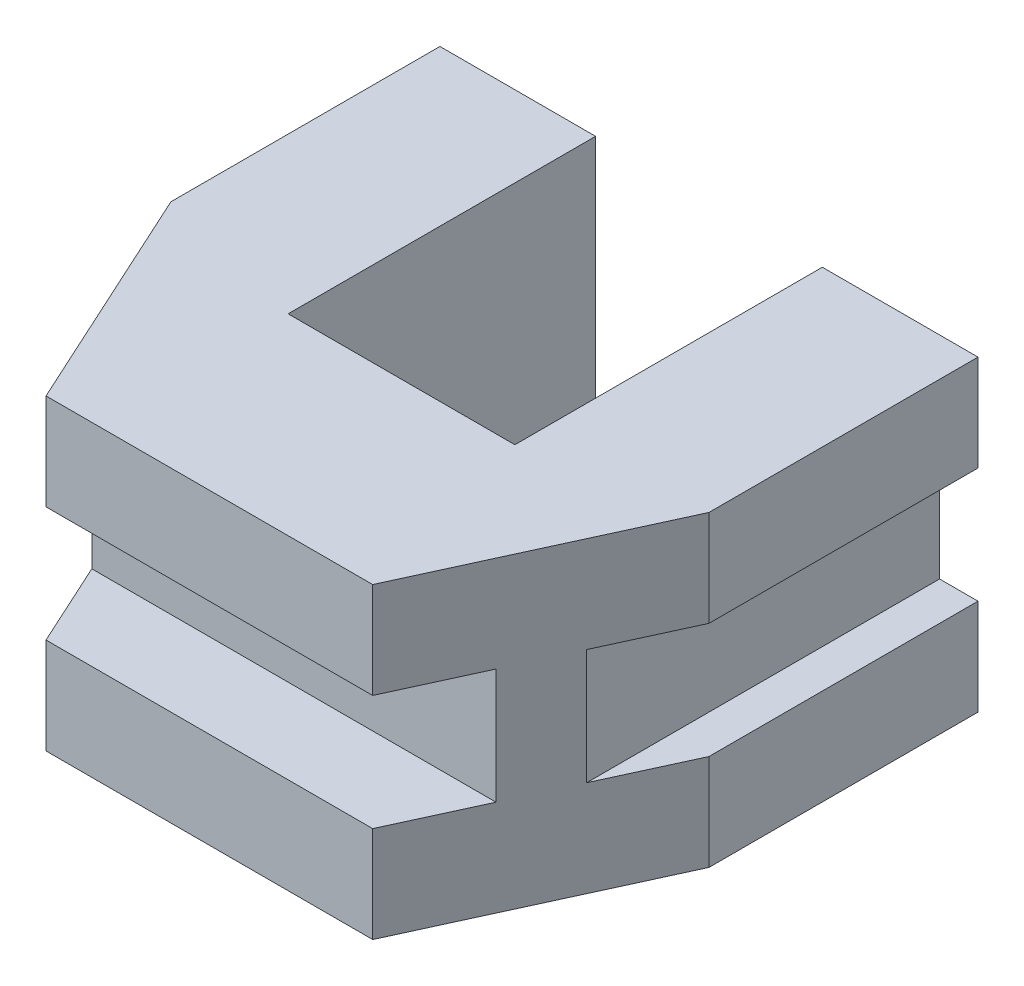
ISO-10303-21;
HEADER;
FILE_DESCRIPTION(('STEP AP214'),'2;1');
FILE_NAME('part.step','',(''),(''),'','','');
FILE_SCHEMA(('AUTOMOTIVE_DESIGN { 1 0 10303 214 1 1 1 1 }'));
ENDSEC;
DATA;
#1=APPLICATION_CONTEXT('core data for automotive mechanical design processes');
#2=APPLICATION_PROTOCOL_DEFINITION('international standard','automotive_design',2000,#1);
#3=PRODUCT_CONTEXT('',#1,'mechanical');
#4=PRODUCT('Part','Part','',(#3));
#5=PRODUCT_RELATED_PRODUCT_CATEGORY('part','',(#4));
#6=PRODUCT_DEFINITION_FORMATION('','',#4);
#7=PRODUCT_DEFINITION_CONTEXT('part definition',#1,'design');
#8=PRODUCT_DEFINITION('design','',#6,#7);
#9=PRODUCT_DEFINITION_SHAPE('','',#8);
#10=(LENGTH_UNIT() NAMED_UNIT(*) SI_UNIT(.MILLI.,.METRE.));
#11=(NAMED_UNIT(*) PLANE_ANGLE_UNIT() SI_UNIT($,.RADIAN.));
#12=(NAMED_UNIT(*) SI_UNIT($,.STERADIAN.) SOLID_ANGLE_UNIT());
#13=UNCERTAINTY_MEASURE_WITH_UNIT(LENGTH_MEASURE(1.E-05),#10,'distance_accuracy_value','');
#14=(GEOMETRIC_REPRESENTATION_CONTEXT(3) GLOBAL_UNCERTAINTY_ASSIGNED_CONTEXT((#13)) GLOBAL_UNIT_ASSIGNED_CONTEXT((#10,
#11,#12)) REPRESENTATION_CONTEXT('',''));
#15=CARTESIAN_POINT('',(0.,0.,0.));
#16=DIRECTION('',(0.,0.,1.));
#17=DIRECTION('',(1.,0.,0.));
#18=AXIS2_PLACEMENT_3D('',#15,#16,#17);
#19=CARTESIAN_POINT('',(-7.,4.,-13.));
#20=DIRECTION('',(1.,0.,0.));
#21=DIRECTION('',(0.,0.,-1.));
#22=AXIS2_PLACEMENT_3D('',#19,#20,#21);
#23=PLANE('',#22);
#24=DIRECTION('',(0.,-1.,0.));
#25=VECTOR('',#24,1.);
#26=CARTESIAN_POINT('',(-7.,4.,-13.));
#27=LINE('',#26,#25);
#28=CARTESIAN_POINT('',(-7.,4.,-13.));
#29=VERTEX_POINT('',#28);
#30=CARTESIAN_POINT('',(-7.,1.5,-13.));
#31=VERTEX_POINT('',#30);
#32=EDGE_CURVE('E211',#29,#31,#27,.T.);
#33=ORIENTED_EDGE('',*,*,#32,.T.);
#34=DIRECTION('',(0.,0.,1.));
#35=VECTOR('',#34,1.);
#36=CARTESIAN_POINT('',(-7.,1.5,-13.));
#37=LINE('',#36,#35);
#38=CARTESIAN_POINT('',(-7.,1.5,-6.));
#39=VERTEX_POINT('',#38);
#40=EDGE_CURVE('E241',#31,#39,#37,.T.);
#41=ORIENTED_EDGE('',*,*,#40,.T.);
#42=DIRECTION('',(0.,-1.,0.));
#43=VECTOR('',#42,1.);
#44=CARTESIAN_POINT('',(-7.,4.,-6.));
#45=LINE('',#44,#43);
#46=CARTESIAN_POINT('',(-7.,4.,-6.));
#47=VERTEX_POINT('',#46);
#48=EDGE_CURVE('E212',#47,#39,#45,.T.);
#49=ORIENTED_EDGE('',*,*,#48,.F.);
#50=DIRECTION('',(0.,0.,1.));
#51=VECTOR('',#50,1.);
#52=CARTESIAN_POINT('',(-7.,4.,-13.));
#53=LINE('',#52,#51);
#54=EDGE_CURVE('E295',#29,#47,#53,.T.);
#55=ORIENTED_EDGE('',*,*,#54,.F.);
#56=EDGE_LOOP('',(#33,#41,#49,#55));
#57=FACE_BOUND('',#56,.T.);
#58=ADVANCED_FACE('F39',(#57),#23,.F.);
#59=CARTESIAN_POINT('',(7.,4.,-13.));
#60=DIRECTION('',(-1.,0.,0.));
#61=DIRECTION('',(0.,0.,1.));
#62=AXIS2_PLACEMENT_3D('',#59,#60,#61);
#63=PLANE('',#62);
#64=DIRECTION('',(0.,-1.,0.));
#65=VECTOR('',#64,1.);
#66=CARTESIAN_POINT('',(7.,4.,-6.));
#67=LINE('',#66,#65);
#68=CARTESIAN_POINT('',(7.,4.,-6.));
#69=VERTEX_POINT('',#68);
#70=CARTESIAN_POINT('',(7.,1.5,-6.));
#71=VERTEX_POINT('',#70);
#72=EDGE_CURVE('E352',#69,#71,#67,.T.);
#73=ORIENTED_EDGE('',*,*,#72,.T.);
#74=DIRECTION('',(0.,0.,1.));
#75=VECTOR('',#74,1.);
#76=CARTESIAN_POINT('',(7.,1.5,-13.));
#77=LINE('',#76,#75);
#78=CARTESIAN_POINT('',(7.,1.5,-13.));
#79=VERTEX_POINT('',#78);
#80=EDGE_CURVE('E196',#79,#71,#77,.T.);
#81=ORIENTED_EDGE('',*,*,#80,.F.);
#82=DIRECTION('',(0.,-1.,0.));
#83=VECTOR('',#82,1.);
#84=CARTESIAN_POINT('',(7.,4.,-13.));
#85=LINE('',#84,#83);
#86=CARTESIAN_POINT('',(7.,4.,-13.));
#87=VERTEX_POINT('',#86);
#88=EDGE_CURVE('E348',#87,#79,#85,.T.);
#89=ORIENTED_EDGE('',*,*,#88,.F.);
#90=DIRECTION('',(0.,0.,-1.));
#91=VECTOR('',#90,1.);
#92=CARTESIAN_POINT('',(7.,4.,-13.));
#93=LINE('',#92,#91);
#94=EDGE_CURVE('E304',#69,#87,#93,.T.);
#95=ORIENTED_EDGE('',*,*,#94,.F.);
#96=EDGE_LOOP('',(#73,#81,#89,#95));
#97=FACE_BOUND('',#96,.T.);
#98=ADVANCED_FACE('F431',(#97),#63,.F.);
#99=CARTESIAN_POINT('',(4.25,4.,0.));
#100=DIRECTION('',(0.,0.,-1.));
#101=DIRECTION('',(-1.,0.,0.));
#102=AXIS2_PLACEMENT_3D('',#99,#100,#101);
#103=PLANE('',#102);
#104=DIRECTION('',(0.,-1.,0.));
#105=VECTOR('',#104,1.);
#106=CARTESIAN_POINT('',(-4.25,4.,0.));
#107=LINE('',#106,#105);
#108=CARTESIAN_POINT('',(-4.25,4.,0.));
#109=VERTEX_POINT('',#108);
#110=CARTESIAN_POINT('',(-4.25,1.5,0.));
#111=VERTEX_POINT('',#110);
#112=EDGE_CURVE('E359',#109,#111,#107,.T.);
#113=ORIENTED_EDGE('',*,*,#112,.T.);
#114=DIRECTION('',(1.,0.,0.));
#115=VECTOR('',#114,1.);
#116=CARTESIAN_POINT('',(-7.,1.5,0.));
#117=LINE('',#116,#115);
#118=CARTESIAN_POINT('',(4.25,1.5,0.));
#119=VERTEX_POINT('',#118);
#120=EDGE_CURVE('E273',#111,#119,#117,.T.);
#121=ORIENTED_EDGE('',*,*,#120,.T.);
#122=DIRECTION('',(0.,-1.,0.));
#123=VECTOR('',#122,1.);
#124=CARTESIAN_POINT('',(4.25,4.,0.));
#125=LINE('',#124,#123);
#126=CARTESIAN_POINT('',(4.25,4.,0.));
#127=VERTEX_POINT('',#126);
#128=EDGE_CURVE('E356',#127,#119,#125,.T.);
#129=ORIENTED_EDGE('',*,*,#128,.F.);
#130=DIRECTION('',(1.,0.,0.));
#131=VECTOR('',#130,1.);
#132=CARTESIAN_POINT('',(4.25,4.,0.));
#133=LINE('',#132,#131);
#134=EDGE_CURVE('E300',#109,#127,#133,.T.);
#135=ORIENTED_EDGE('',*,*,#134,.F.);
#136=EDGE_LOOP('',(#113,#121,#129,#135));
#137=FACE_BOUND('',#136,.T.);
#138=ADVANCED_FACE('F389',(#137),#103,.F.);
#139=CARTESIAN_POINT('',(-7.,4.,-13.));
#140=DIRECTION('',(0.,0.,1.));
#141=DIRECTION('',(1.,0.,0.));
#142=AXIS2_PLACEMENT_3D('',#139,#140,#141);
#143=PLANE('',#142);
#144=DIRECTION('',(0.,1.,0.));
#145=VECTOR('',#144,1.);
#146=CARTESIAN_POINT('',(-6.,1.5,-13.));
#147=LINE('',#146,#145);
#148=CARTESIAN_POINT('',(-6.,-1.5,-13.));
#149=VERTEX_POINT('',#148);
#150=CARTESIAN_POINT('',(-6.,1.5,-13.));
#151=VERTEX_POINT('',#150);
#152=EDGE_CURVE('E195',#149,#151,#147,.T.);
#153=ORIENTED_EDGE('',*,*,#152,.T.);
#154=DIRECTION('',(-1.,0.,0.));
#155=VECTOR('',#154,1.);
#156=CARTESIAN_POINT('',(-7.,1.5,-13.));
#157=LINE('',#156,#155);
#158=EDGE_CURVE('E205',#151,#31,#157,.T.);
#159=ORIENTED_EDGE('',*,*,#158,.T.);
#160=ORIENTED_EDGE('',*,*,#32,.F.);
#161=DIRECTION('',(-1.,0.,0.));
#162=VECTOR('',#161,1.);
#163=CARTESIAN_POINT('',(-7.,4.,-13.));
#164=LINE('',#163,#162);
#165=CARTESIAN_POINT('',(-2.95,4.,-13.));
#166=VERTEX_POINT('',#165);
#167=EDGE_CURVE('E292',#166,#29,#164,.T.);
#168=ORIENTED_EDGE('',*,*,#167,.F.);
#169=DIRECTION('',(0.,-1.,0.));
#170=VECTOR('',#169,1.);
#171=CARTESIAN_POINT('',(-2.95,4.,-13.));
#172=LINE('',#171,#170);
#173=CARTESIAN_POINT('',(-2.95,-4.,-13.));
#174=VERTEX_POINT('',#173);
#175=EDGE_CURVE('E314',#166,#174,#172,.T.);
#176=ORIENTED_EDGE('',*,*,#175,.T.);
#177=DIRECTION('',(-1.,0.,0.));
#178=VECTOR('',#177,1.);
#179=CARTESIAN_POINT('',(-7.,-4.,-13.));
#180=LINE('',#179,#178);
#181=CARTESIAN_POINT('',(-7.,-4.,-13.));
#182=VERTEX_POINT('',#181);
#183=EDGE_CURVE('E210',#174,#182,#180,.T.);
#184=ORIENTED_EDGE('',*,*,#183,.T.);
#185=CARTESIAN_POINT('',(-7.,-1.5,-13.));
#186=VERTEX_POINT('',#185);
#187=EDGE_CURVE('E202',#186,#182,#27,.T.);
#188=ORIENTED_EDGE('',*,*,#187,.F.);
#189=DIRECTION('',(1.,0.,0.));
#190=VECTOR('',#189,1.);
#191=CARTESIAN_POINT('',(-7.,-1.5,-13.));
#192=LINE('',#191,#190);
#193=EDGE_CURVE('E187',#186,#149,#192,.T.);
#194=ORIENTED_EDGE('',*,*,#193,.T.);
#195=EDGE_LOOP('',(#153,#159,#160,#168,#176,#184,#188,#194));
#196=FACE_BOUND('',#195,.T.);
#197=ADVANCED_FACE('F41',(#196),#143,.F.);
#198=CARTESIAN_POINT('',(-7.,-1.5,-6.));
#199=VERTEX_POINT('',#198);
#200=CARTESIAN_POINT('',(-7.,-4.,-6.));
#201=VERTEX_POINT('',#200);
#202=EDGE_CURVE('E204',#199,#201,#45,.T.);
#203=ORIENTED_EDGE('',*,*,#202,.F.);
#204=DIRECTION('',(0.,0.,1.));
#205=VECTOR('',#204,1.);
#206=CARTESIAN_POINT('',(-7.,-1.5,-13.));
#207=LINE('',#206,#205);
#208=EDGE_CURVE('E54',#186,#199,#207,.T.);
#209=ORIENTED_EDGE('',*,*,#208,.F.);
#210=ORIENTED_EDGE('',*,*,#187,.T.);
#211=DIRECTION('',(0.,0.,1.));
#212=VECTOR('',#211,1.);
#213=CARTESIAN_POINT('',(-7.,-4.,-13.));
#214=LINE('',#213,#212);
#215=EDGE_CURVE('E316',#182,#201,#214,.T.);
#216=ORIENTED_EDGE('',*,*,#215,.T.);
#217=EDGE_LOOP('',(#203,#209,#210,#216));
#218=FACE_BOUND('',#217,.T.);
#219=ADVANCED_FACE('F200',(#218),#23,.F.);
#220=CARTESIAN_POINT('',(-7.,4.,-6.));
#221=DIRECTION('',(0.909064822894284,0.,-0.416654710493213));
#222=DIRECTION('',(-0.416654710493213,0.,-0.909064822894284));
#223=AXIS2_PLACEMENT_3D('',#220,#221,#222);
#224=PLANE('',#223);
#225=ORIENTED_EDGE('',*,*,#48,.T.);
#226=DIRECTION('',(0.416654710493213,0.,0.909064822894284));
#227=VECTOR('',#226,1.);
#228=CARTESIAN_POINT('',(-7.,1.5,-6.));
#229=LINE('',#228,#227);
#230=CARTESIAN_POINT('',(-6.,1.5,-3.81818181818182));
#231=VERTEX_POINT('',#230);
#232=EDGE_CURVE('E11',#39,#231,#229,.T.);
#233=ORIENTED_EDGE('',*,*,#232,.T.);
#234=DIRECTION('',(0.,-1.,0.));
#235=VECTOR('',#234,1.);
#236=CARTESIAN_POINT('',(-6.,4.,-3.81818181818182));
#237=LINE('',#236,#235);
#238=CARTESIAN_POINT('',(-6.,-1.5,-3.81818181818182));
#239=VERTEX_POINT('',#238);
#240=EDGE_CURVE('E47',#231,#239,#237,.T.);
#241=ORIENTED_EDGE('',*,*,#240,.T.);
#242=DIRECTION('',(-0.416654710493213,0.,-0.909064822894284));
#243=VECTOR('',#242,1.);
#244=CARTESIAN_POINT('',(-7.,-1.5,-6.));
#245=LINE('',#244,#243);
#246=EDGE_CURVE('E228',#239,#199,#245,.T.);
#247=ORIENTED_EDGE('',*,*,#246,.T.);
#248=ORIENTED_EDGE('',*,*,#202,.T.);
#249=DIRECTION('',(0.416654710493213,0.,0.909064822894284));
#250=VECTOR('',#249,1.);
#251=CARTESIAN_POINT('',(-7.,-4.,-6.));
#252=LINE('',#251,#250);
#253=CARTESIAN_POINT('',(-4.25,-4.,0.));
#254=VERTEX_POINT('',#253);
#255=EDGE_CURVE('E318',#201,#254,#252,.T.);
#256=ORIENTED_EDGE('',*,*,#255,.T.);
#257=CARTESIAN_POINT('',(-4.25,-1.5,0.));
#258=VERTEX_POINT('',#257);
#259=EDGE_CURVE('E358',#258,#254,#107,.T.);
#260=ORIENTED_EDGE('',*,*,#259,.F.);
#261=DIRECTION('',(-0.416654710493213,0.,-0.909064822894284));
#262=VECTOR('',#261,1.);
#263=CARTESIAN_POINT('',(-7.,-1.5,-6.));
#264=LINE('',#263,#262);
#265=CARTESIAN_POINT('',(-5.25833333333333,-1.5,-2.2));
#266=VERTEX_POINT('',#265);
#267=EDGE_CURVE('E276',#258,#266,#264,.T.);
#268=ORIENTED_EDGE('',*,*,#267,.T.);
#269=DIRECTION('',(0.,1.,0.));
#270=VECTOR('',#269,1.);
#271=CARTESIAN_POINT('',(-5.25833333333333,4.,-2.2));
#272=LINE('',#271,#270);
#273=CARTESIAN_POINT('',(-5.25833333333333,1.5,-2.2));
#274=VERTEX_POINT('',#273);
#275=EDGE_CURVE('E286',#266,#274,#272,.T.);
#276=ORIENTED_EDGE('',*,*,#275,.T.);
#277=DIRECTION('',(0.416654710493213,0.,0.909064822894284));
#278=VECTOR('',#277,1.);
#279=CARTESIAN_POINT('',(-7.,1.5,-6.));
#280=LINE('',#279,#278);
#281=EDGE_CURVE('E289',#274,#111,#280,.T.);
#282=ORIENTED_EDGE('',*,*,#281,.T.);
#283=ORIENTED_EDGE('',*,*,#112,.F.);
#284=DIRECTION('',(0.416654710493213,0.,0.909064822894284));
#285=VECTOR('',#284,1.);
#286=CARTESIAN_POINT('',(-7.,4.,-6.));
#287=LINE('',#286,#285);
#288=EDGE_CURVE('E298',#47,#109,#287,.T.);
#289=ORIENTED_EDGE('',*,*,#288,.F.);
#290=EDGE_LOOP('',(#225,#233,#241,#247,#248,#256,#260,#268,#276,#282,#283,#289));
#291=FACE_BOUND('',#290,.T.);
#292=ADVANCED_FACE('F231',(#291),#224,.F.);
#293=CARTESIAN_POINT('',(4.25,-1.5,0.));
#294=VERTEX_POINT('',#293);
#295=CARTESIAN_POINT('',(4.25,-4.,0.));
#296=VERTEX_POINT('',#295);
#297=EDGE_CURVE('E355',#294,#296,#125,.T.);
#298=ORIENTED_EDGE('',*,*,#297,.F.);
#299=DIRECTION('',(1.,0.,0.));
#300=VECTOR('',#299,1.);
#301=CARTESIAN_POINT('',(-7.,-1.5,0.));
#302=LINE('',#301,#300);
#303=EDGE_CURVE('E272',#258,#294,#302,.T.);
#304=ORIENTED_EDGE('',*,*,#303,.F.);
#305=ORIENTED_EDGE('',*,*,#259,.T.);
#306=DIRECTION('',(1.,0.,0.));
#307=VECTOR('',#306,1.);
#308=CARTESIAN_POINT('',(4.25,-4.,0.));
#309=LINE('',#308,#307);
#310=EDGE_CURVE('E321',#254,#296,#309,.T.);
#311=ORIENTED_EDGE('',*,*,#310,.T.);
#312=EDGE_LOOP('',(#298,#304,#305,#311));
#313=FACE_BOUND('',#312,.T.);
#314=ADVANCED_FACE('F368',(#313),#103,.F.);
#315=CARTESIAN_POINT('',(7.,4.,-6.));
#316=DIRECTION('',(-0.909064822894284,0.,-0.416654710493213));
#317=DIRECTION('',(-0.416654710493213,0.,0.909064822894284));
#318=AXIS2_PLACEMENT_3D('',#315,#316,#317);
#319=PLANE('',#318);
#320=DIRECTION('',(0.,1.,0.));
#321=VECTOR('',#320,1.);
#322=CARTESIAN_POINT('',(6.,4.,-3.81818181818182));
#323=LINE('',#322,#321);
#324=CARTESIAN_POINT('',(6.,-1.5,-3.81818181818182));
#325=VERTEX_POINT('',#324);
#326=CARTESIAN_POINT('',(6.,1.5,-3.81818181818182));
#327=VERTEX_POINT('',#326);
#328=EDGE_CURVE('E243',#325,#327,#323,.T.);
#329=ORIENTED_EDGE('',*,*,#328,.T.);
#330=DIRECTION('',(0.416654710493213,0.,-0.909064822894284));
#331=VECTOR('',#330,1.);
#332=CARTESIAN_POINT('',(7.,1.5,-5.99999999999999));
#333=LINE('',#332,#331);
#334=EDGE_CURVE('E269',#327,#71,#333,.T.);
#335=ORIENTED_EDGE('',*,*,#334,.T.);
#336=ORIENTED_EDGE('',*,*,#72,.F.);
#337=DIRECTION('',(0.416654710493213,0.,-0.909064822894284));
#338=VECTOR('',#337,1.);
#339=CARTESIAN_POINT('',(7.,4.,-6.));
#340=LINE('',#339,#338);
#341=EDGE_CURVE('E302',#127,#69,#340,.T.);
#342=ORIENTED_EDGE('',*,*,#341,.F.);
#343=ORIENTED_EDGE('',*,*,#128,.T.);
#344=DIRECTION('',(0.416654710493213,0.,-0.909064822894284));
#345=VECTOR('',#344,1.);
#346=CARTESIAN_POINT('',(7.,1.5,-6.));
#347=LINE('',#346,#345);
#348=CARTESIAN_POINT('',(5.25833333333333,1.5,-2.2));
#349=VERTEX_POINT('',#348);
#350=EDGE_CURVE('E225',#119,#349,#347,.T.);
#351=ORIENTED_EDGE('',*,*,#350,.T.);
#352=DIRECTION('',(0.,-1.,0.));
#353=VECTOR('',#352,1.);
#354=CARTESIAN_POINT('',(5.25833333333333,4.,-2.2));
#355=LINE('',#354,#353);
#356=CARTESIAN_POINT('',(5.25833333333333,-1.5,-2.2));
#357=VERTEX_POINT('',#356);
#358=EDGE_CURVE('E222',#349,#357,#355,.T.);
#359=ORIENTED_EDGE('',*,*,#358,.T.);
#360=DIRECTION('',(-0.416654710493213,0.,0.909064822894284));
#361=VECTOR('',#360,1.);
#362=CARTESIAN_POINT('',(7.,-1.5,-6.));
#363=LINE('',#362,#361);
#364=EDGE_CURVE('E215',#357,#294,#363,.T.);
#365=ORIENTED_EDGE('',*,*,#364,.T.);
#366=ORIENTED_EDGE('',*,*,#297,.T.);
#367=DIRECTION('',(0.416654710493213,0.,-0.909064822894284));
#368=VECTOR('',#367,1.);
#369=CARTESIAN_POINT('',(7.,-4.,-6.));
#370=LINE('',#369,#368);
#371=CARTESIAN_POINT('',(7.,-4.,-6.));
#372=VERTEX_POINT('',#371);
#373=EDGE_CURVE('E324',#296,#372,#370,.T.);
#374=ORIENTED_EDGE('',*,*,#373,.T.);
#375=CARTESIAN_POINT('',(7.,-1.5,-6.));
#376=VERTEX_POINT('',#375);
#377=EDGE_CURVE('E351',#376,#372,#67,.T.);
#378=ORIENTED_EDGE('',*,*,#377,.F.);
#379=DIRECTION('',(-0.416654710493213,0.,0.909064822894284));
#380=VECTOR('',#379,1.);
#381=CARTESIAN_POINT('',(7.,-1.5,-6.));
#382=LINE('',#381,#380);
#383=EDGE_CURVE('E266',#376,#325,#382,.T.);
#384=ORIENTED_EDGE('',*,*,#383,.T.);
#385=EDGE_LOOP('',(#329,#335,#336,#342,#343,#351,#359,#365,#366,#374,#378,#384));
#386=FACE_BOUND('',#385,.T.);
#387=ADVANCED_FACE('F378',(#386),#319,.F.);
#388=CARTESIAN_POINT('',(7.,-1.5,-13.));
#389=VERTEX_POINT('',#388);
#390=CARTESIAN_POINT('',(7.,-4.,-13.));
#391=VERTEX_POINT('',#390);
#392=EDGE_CURVE('E347',#389,#391,#85,.T.);
#393=ORIENTED_EDGE('',*,*,#392,.F.);
#394=DIRECTION('',(0.,0.,1.));
#395=VECTOR('',#394,1.);
#396=CARTESIAN_POINT('',(7.,-1.5,-13.));
#397=LINE('',#396,#395);
#398=EDGE_CURVE('E257',#389,#376,#397,.T.);
#399=ORIENTED_EDGE('',*,*,#398,.T.);
#400=ORIENTED_EDGE('',*,*,#377,.T.);
#401=DIRECTION('',(0.,0.,-1.));
#402=VECTOR('',#401,1.);
#403=CARTESIAN_POINT('',(7.,-4.,-13.));
#404=LINE('',#403,#402);
#405=EDGE_CURVE('E327',#372,#391,#404,.T.);
#406=ORIENTED_EDGE('',*,*,#405,.T.);
#407=EDGE_LOOP('',(#393,#399,#400,#406));
#408=FACE_BOUND('',#407,.T.);
#409=ADVANCED_FACE('F422',(#408),#63,.F.);
#410=CARTESIAN_POINT('',(7.,4.,-13.));
#411=DIRECTION('',(0.,0.,1.));
#412=DIRECTION('',(1.,0.,0.));
#413=AXIS2_PLACEMENT_3D('',#410,#411,#412);
#414=PLANE('',#413);
#415=ORIENTED_EDGE('',*,*,#88,.T.);
#416=DIRECTION('',(-1.,0.,0.));
#417=VECTOR('',#416,1.);
#418=CARTESIAN_POINT('',(7.,1.5,-13.));
#419=LINE('',#418,#417);
#420=CARTESIAN_POINT('',(6.,1.5,-13.));
#421=VERTEX_POINT('',#420);
#422=EDGE_CURVE('E248',#79,#421,#419,.T.);
#423=ORIENTED_EDGE('',*,*,#422,.T.);
#424=DIRECTION('',(0.,-1.,0.));
#425=VECTOR('',#424,1.);
#426=CARTESIAN_POINT('',(6.,1.5,-13.));
#427=LINE('',#426,#425);
#428=CARTESIAN_POINT('',(6.,-1.5,-13.));
#429=VERTEX_POINT('',#428);
#430=EDGE_CURVE('E251',#421,#429,#427,.T.);
#431=ORIENTED_EDGE('',*,*,#430,.T.);
#432=DIRECTION('',(1.,0.,0.));
#433=VECTOR('',#432,1.);
#434=CARTESIAN_POINT('',(7.,-1.5,-13.));
#435=LINE('',#434,#433);
#436=EDGE_CURVE('E62',#429,#389,#435,.T.);
#437=ORIENTED_EDGE('',*,*,#436,.T.);
#438=ORIENTED_EDGE('',*,*,#392,.T.);
#439=DIRECTION('',(-1.,0.,0.));
#440=VECTOR('',#439,1.);
#441=CARTESIAN_POINT('',(7.,-4.,-13.));
#442=LINE('',#441,#440);
#443=CARTESIAN_POINT('',(2.95,-4.,-13.));
#444=VERTEX_POINT('',#443);
#445=EDGE_CURVE('E330',#391,#444,#442,.T.);
#446=ORIENTED_EDGE('',*,*,#445,.T.);
#447=DIRECTION('',(0.,-1.,0.));
#448=VECTOR('',#447,1.);
#449=CARTESIAN_POINT('',(2.95,4.,-13.));
#450=LINE('',#449,#448);
#451=CARTESIAN_POINT('',(2.95,4.,-13.));
#452=VERTEX_POINT('',#451);
#453=EDGE_CURVE('E344',#452,#444,#450,.T.);
#454=ORIENTED_EDGE('',*,*,#453,.F.);
#455=DIRECTION('',(-1.,0.,0.));
#456=VECTOR('',#455,1.);
#457=CARTESIAN_POINT('',(7.,4.,-13.));
#458=LINE('',#457,#456);
#459=EDGE_CURVE('E306',#87,#452,#458,.T.);
#460=ORIENTED_EDGE('',*,*,#459,.F.);
#461=EDGE_LOOP('',(#415,#423,#431,#437,#438,#446,#454,#460));
#462=FACE_BOUND('',#461,.T.);
#463=ADVANCED_FACE('F419',(#462),#414,.F.);
#464=CARTESIAN_POINT('',(2.95,4.,-13.));
#465=DIRECTION('',(1.,0.,0.));
#466=DIRECTION('',(0.,0.,-1.));
#467=AXIS2_PLACEMENT_3D('',#464,#465,#466);
#468=PLANE('',#467);
#469=DIRECTION('',(0.,0.,1.));
#470=VECTOR('',#469,1.);
#471=CARTESIAN_POINT('',(2.95,-4.,-13.));
#472=LINE('',#471,#470);
#473=CARTESIAN_POINT('',(2.95,-4.,-5.));
#474=VERTEX_POINT('',#473);
#475=EDGE_CURVE('E332',#444,#474,#472,.T.);
#476=ORIENTED_EDGE('',*,*,#475,.T.);
#477=DIRECTION('',(0.,-1.,0.));
#478=VECTOR('',#477,1.);
#479=CARTESIAN_POINT('',(2.95,4.,-5.));
#480=LINE('',#479,#478);
#481=CARTESIAN_POINT('',(2.95,4.,-5.));
#482=VERTEX_POINT('',#481);
#483=EDGE_CURVE('E341',#482,#474,#480,.T.);
#484=ORIENTED_EDGE('',*,*,#483,.F.);
#485=DIRECTION('',(0.,0.,1.));
#486=VECTOR('',#485,1.);
#487=CARTESIAN_POINT('',(2.95,4.,-13.));
#488=LINE('',#487,#486);
#489=EDGE_CURVE('E308',#452,#482,#488,.T.);
#490=ORIENTED_EDGE('',*,*,#489,.F.);
#491=ORIENTED_EDGE('',*,*,#453,.T.);
#492=EDGE_LOOP('',(#476,#484,#490,#491));
#493=FACE_BOUND('',#492,.T.);
#494=ADVANCED_FACE('F415',(#493),#468,.F.);
#495=CARTESIAN_POINT('',(-2.95,4.,-5.));
#496=DIRECTION('',(0.,0.,1.));
#497=DIRECTION('',(1.,0.,0.));
#498=AXIS2_PLACEMENT_3D('',#495,#496,#497);
#499=PLANE('',#498);
#500=DIRECTION('',(-1.,0.,0.));
#501=VECTOR('',#500,1.);
#502=CARTESIAN_POINT('',(-2.95,-4.,-5.));
#503=LINE('',#502,#501);
#504=CARTESIAN_POINT('',(-2.95,-4.,-5.));
#505=VERTEX_POINT('',#504);
#506=EDGE_CURVE('E334',#474,#505,#503,.T.);
#507=ORIENTED_EDGE('',*,*,#506,.T.);
#508=DIRECTION('',(0.,-1.,0.));
#509=VECTOR('',#508,1.);
#510=CARTESIAN_POINT('',(-2.95,4.,-5.));
#511=LINE('',#510,#509);
#512=CARTESIAN_POINT('',(-2.95,4.,-5.));
#513=VERTEX_POINT('',#512);
#514=EDGE_CURVE('E338',#513,#505,#511,.T.);
#515=ORIENTED_EDGE('',*,*,#514,.F.);
#516=DIRECTION('',(-1.,0.,0.));
#517=VECTOR('',#516,1.);
#518=CARTESIAN_POINT('',(-2.95,4.,-5.));
#519=LINE('',#518,#517);
#520=EDGE_CURVE('E310',#482,#513,#519,.T.);
#521=ORIENTED_EDGE('',*,*,#520,.F.);
#522=ORIENTED_EDGE('',*,*,#483,.T.);
#523=EDGE_LOOP('',(#507,#515,#521,#522));
#524=FACE_BOUND('',#523,.T.);
#525=ADVANCED_FACE('F411',(#524),#499,.F.);
#526=CARTESIAN_POINT('',(-2.95,4.,-13.));
#527=DIRECTION('',(-1.,0.,0.));
#528=DIRECTION('',(0.,0.,1.));
#529=AXIS2_PLACEMENT_3D('',#526,#527,#528);
#530=PLANE('',#529);
#531=DIRECTION('',(0.,0.,-1.));
#532=VECTOR('',#531,1.);
#533=CARTESIAN_POINT('',(-2.95,-4.,-13.));
#534=LINE('',#533,#532);
#535=EDGE_CURVE('E296',#505,#174,#534,.T.);
#536=ORIENTED_EDGE('',*,*,#535,.T.);
#537=ORIENTED_EDGE('',*,*,#175,.F.);
#538=DIRECTION('',(0.,0.,-1.));
#539=VECTOR('',#538,1.);
#540=CARTESIAN_POINT('',(-2.95,4.,-13.));
#541=LINE('',#540,#539);
#542=EDGE_CURVE('E312',#513,#166,#541,.T.);
#543=ORIENTED_EDGE('',*,*,#542,.F.);
#544=ORIENTED_EDGE('',*,*,#514,.T.);
#545=EDGE_LOOP('',(#536,#537,#543,#544));
#546=FACE_BOUND('',#545,.T.);
#547=ADVANCED_FACE('F406',(#546),#530,.F.);
#548=CARTESIAN_POINT('',(0.,4.,0.));
#549=DIRECTION('',(0.,-1.,0.));
#550=DIRECTION('',(0.,0.,-1.));
#551=AXIS2_PLACEMENT_3D('',#548,#549,#550);
#552=PLANE('',#551);
#553=ORIENTED_EDGE('',*,*,#167,.T.);
#554=ORIENTED_EDGE('',*,*,#54,.T.);
#555=ORIENTED_EDGE('',*,*,#288,.T.);
#556=ORIENTED_EDGE('',*,*,#134,.T.);
#557=ORIENTED_EDGE('',*,*,#341,.T.);
#558=ORIENTED_EDGE('',*,*,#94,.T.);
#559=ORIENTED_EDGE('',*,*,#459,.T.);
#560=ORIENTED_EDGE('',*,*,#489,.T.);
#561=ORIENTED_EDGE('',*,*,#520,.T.);
#562=ORIENTED_EDGE('',*,*,#542,.T.);
#563=EDGE_LOOP('',(#553,#554,#555,#556,#557,#558,#559,#560,#561,#562));
#564=FACE_BOUND('',#563,.T.);
#565=ADVANCED_FACE('F394',(#564),#552,.F.);
#566=CARTESIAN_POINT('',(0.,-4.,0.));
#567=DIRECTION('',(0.,-1.,0.));
#568=DIRECTION('',(0.,0.,-1.));
#569=AXIS2_PLACEMENT_3D('',#566,#567,#568);
#570=PLANE('',#569);
#571=ORIENTED_EDGE('',*,*,#183,.F.);
#572=ORIENTED_EDGE('',*,*,#535,.F.);
#573=ORIENTED_EDGE('',*,*,#506,.F.);
#574=ORIENTED_EDGE('',*,*,#475,.F.);
#575=ORIENTED_EDGE('',*,*,#445,.F.);
#576=ORIENTED_EDGE('',*,*,#405,.F.);
#577=ORIENTED_EDGE('',*,*,#373,.F.);
#578=ORIENTED_EDGE('',*,*,#310,.F.);
#579=ORIENTED_EDGE('',*,*,#255,.F.);
#580=ORIENTED_EDGE('',*,*,#215,.F.);
#581=EDGE_LOOP('',(#571,#572,#573,#574,#575,#576,#577,#578,#579,#580));
#582=FACE_BOUND('',#581,.T.);
#583=ADVANCED_FACE('F373',(#582),#570,.T.);
#584=CARTESIAN_POINT('',(-7.,1.5,0.));
#585=DIRECTION('',(0.,1.,0.));
#586=DIRECTION('',(0.,0.,1.));
#587=AXIS2_PLACEMENT_3D('',#584,#585,#586);
#588=PLANE('',#587);
#589=DIRECTION('',(1.,0.,0.));
#590=VECTOR('',#589,1.);
#591=CARTESIAN_POINT('',(-7.,1.5,-2.2));
#592=LINE('',#591,#590);
#593=EDGE_CURVE('E277',#274,#349,#592,.T.);
#594=ORIENTED_EDGE('',*,*,#593,.T.);
#595=ORIENTED_EDGE('',*,*,#350,.F.);
#596=ORIENTED_EDGE('',*,*,#120,.F.);
#597=ORIENTED_EDGE('',*,*,#281,.F.);
#598=EDGE_LOOP('',(#594,#595,#596,#597));
#599=FACE_BOUND('',#598,.T.);
#600=ADVANCED_FACE('F387',(#599),#588,.F.);
#601=CARTESIAN_POINT('',(-7.,1.5,-2.2));
#602=DIRECTION('',(0.,0.,-1.));
#603=DIRECTION('',(0.,1.,0.));
#604=AXIS2_PLACEMENT_3D('',#601,#602,#603);
#605=PLANE('',#604);
#606=DIRECTION('',(1.,0.,0.));
#607=VECTOR('',#606,1.);
#608=CARTESIAN_POINT('',(-7.,-1.5,-2.2));
#609=LINE('',#608,#607);
#610=EDGE_CURVE('E280',#266,#357,#609,.T.);
#611=ORIENTED_EDGE('',*,*,#610,.T.);
#612=ORIENTED_EDGE('',*,*,#358,.F.);
#613=ORIENTED_EDGE('',*,*,#593,.F.);
#614=ORIENTED_EDGE('',*,*,#275,.F.);
#615=EDGE_LOOP('',(#611,#612,#613,#614));
#616=FACE_BOUND('',#615,.T.);
#617=ADVANCED_FACE('F383',(#616),#605,.F.);
#618=CARTESIAN_POINT('',(-7.,-1.5,0.));
#619=DIRECTION('',(0.,-1.,0.));
#620=DIRECTION('',(0.,0.,-1.));
#621=AXIS2_PLACEMENT_3D('',#618,#619,#620);
#622=PLANE('',#621);
#623=ORIENTED_EDGE('',*,*,#303,.T.);
#624=ORIENTED_EDGE('',*,*,#364,.F.);
#625=ORIENTED_EDGE('',*,*,#610,.F.);
#626=ORIENTED_EDGE('',*,*,#267,.F.);
#627=EDGE_LOOP('',(#623,#624,#625,#626));
#628=FACE_BOUND('',#627,.T.);
#629=ADVANCED_FACE('F381',(#628),#622,.F.);
#630=CARTESIAN_POINT('',(7.,1.5,-13.));
#631=DIRECTION('',(0.,1.,0.));
#632=DIRECTION('',(-1.,0.,0.));
#633=AXIS2_PLACEMENT_3D('',#630,#631,#632);
#634=PLANE('',#633);
#635=DIRECTION('',(0.,0.,1.));
#636=VECTOR('',#635,1.);
#637=CARTESIAN_POINT('',(6.,1.5,-13.));
#638=LINE('',#637,#636);
#639=EDGE_CURVE('E255',#421,#327,#638,.T.);
#640=ORIENTED_EDGE('',*,*,#639,.F.);
#641=ORIENTED_EDGE('',*,*,#422,.F.);
#642=ORIENTED_EDGE('',*,*,#80,.T.);
#643=ORIENTED_EDGE('',*,*,#334,.F.);
#644=EDGE_LOOP('',(#640,#641,#642,#643));
#645=FACE_BOUND('',#644,.T.);
#646=ADVANCED_FACE('F428',(#645),#634,.F.);
#647=CARTESIAN_POINT('',(7.,-1.5,-13.));
#648=DIRECTION('',(0.,-1.,0.));
#649=DIRECTION('',(1.,0.,0.));
#650=AXIS2_PLACEMENT_3D('',#647,#648,#649);
#651=PLANE('',#650);
#652=ORIENTED_EDGE('',*,*,#398,.F.);
#653=ORIENTED_EDGE('',*,*,#436,.F.);
#654=DIRECTION('',(0.,0.,1.));
#655=VECTOR('',#654,1.);
#656=CARTESIAN_POINT('',(6.,-1.5,-13.));
#657=LINE('',#656,#655);
#658=EDGE_CURVE('E260',#429,#325,#657,.T.);
#659=ORIENTED_EDGE('',*,*,#658,.T.);
#660=ORIENTED_EDGE('',*,*,#383,.F.);
#661=EDGE_LOOP('',(#652,#653,#659,#660));
#662=FACE_BOUND('',#661,.T.);
#663=ADVANCED_FACE('F423',(#662),#651,.F.);
#664=CARTESIAN_POINT('',(6.,1.5,-13.));
#665=DIRECTION('',(-1.,0.,0.));
#666=DIRECTION('',(0.,0.,1.));
#667=AXIS2_PLACEMENT_3D('',#664,#665,#666);
#668=PLANE('',#667);
#669=ORIENTED_EDGE('',*,*,#658,.F.);
#670=ORIENTED_EDGE('',*,*,#430,.F.);
#671=ORIENTED_EDGE('',*,*,#639,.T.);
#672=ORIENTED_EDGE('',*,*,#328,.F.);
#673=EDGE_LOOP('',(#669,#670,#671,#672));
#674=FACE_BOUND('',#673,.T.);
#675=ADVANCED_FACE('F425',(#674),#668,.F.);
#676=CARTESIAN_POINT('',(-7.,1.5,-13.));
#677=DIRECTION('',(0.,1.,0.));
#678=DIRECTION('',(0.,0.,1.));
#679=AXIS2_PLACEMENT_3D('',#676,#677,#678);
#680=PLANE('',#679);
#681=ORIENTED_EDGE('',*,*,#40,.F.);
#682=ORIENTED_EDGE('',*,*,#158,.F.);
#683=DIRECTION('',(0.,0.,1.));
#684=VECTOR('',#683,1.);
#685=CARTESIAN_POINT('',(-6.,1.5,-13.));
#686=LINE('',#685,#684);
#687=EDGE_CURVE('E235',#151,#231,#686,.T.);
#688=ORIENTED_EDGE('',*,*,#687,.T.);
#689=ORIENTED_EDGE('',*,*,#232,.F.);
#690=EDGE_LOOP('',(#681,#682,#688,#689));
#691=FACE_BOUND('',#690,.T.);
#692=ADVANCED_FACE('F238',(#691),#680,.F.);
#693=CARTESIAN_POINT('',(-6.,1.5,-13.));
#694=DIRECTION('',(1.,0.,0.));
#695=DIRECTION('',(0.,0.,-1.));
#696=AXIS2_PLACEMENT_3D('',#693,#694,#695);
#697=PLANE('',#696);
#698=ORIENTED_EDGE('',*,*,#687,.F.);
#699=ORIENTED_EDGE('',*,*,#152,.F.);
#700=DIRECTION('',(0.,0.,1.));
#701=VECTOR('',#700,1.);
#702=CARTESIAN_POINT('',(-6.,-1.5,-13.));
#703=LINE('',#702,#701);
#704=EDGE_CURVE('E190',#149,#239,#703,.T.);
#705=ORIENTED_EDGE('',*,*,#704,.T.);
#706=ORIENTED_EDGE('',*,*,#240,.F.);
#707=EDGE_LOOP('',(#698,#699,#705,#706));
#708=FACE_BOUND('',#707,.T.);
#709=ADVANCED_FACE('F234',(#708),#697,.F.);
#710=CARTESIAN_POINT('',(-7.,-1.5,-13.));
#711=DIRECTION('',(0.,-1.,0.));
#712=DIRECTION('',(0.,0.,-1.));
#713=AXIS2_PLACEMENT_3D('',#710,#711,#712);
#714=PLANE('',#713);
#715=ORIENTED_EDGE('',*,*,#704,.F.);
#716=ORIENTED_EDGE('',*,*,#193,.F.);
#717=ORIENTED_EDGE('',*,*,#208,.T.);
#718=ORIENTED_EDGE('',*,*,#246,.F.);
#719=EDGE_LOOP('',(#715,#716,#717,#718));
#720=FACE_BOUND('',#719,.T.);
#721=ADVANCED_FACE('F188',(#720),#714,.F.);
#722=CLOSED_SHELL('',(#58,#98,#138,#197,#219,#292,#314,#387,#409,#463,#494,#525,#547,#565,#583,
#600,#617,#629,#646,#663,#675,#692,#709,#721));
#723=MANIFOLD_SOLID_BREP('B2',#722);
#724=ADVANCED_BREP_SHAPE_REPRESENTATION('',(#18,#723),#14);
#725=SHAPE_DEFINITION_REPRESENTATION(#9,#724);
ENDSEC;
END-ISO-10303-21;
